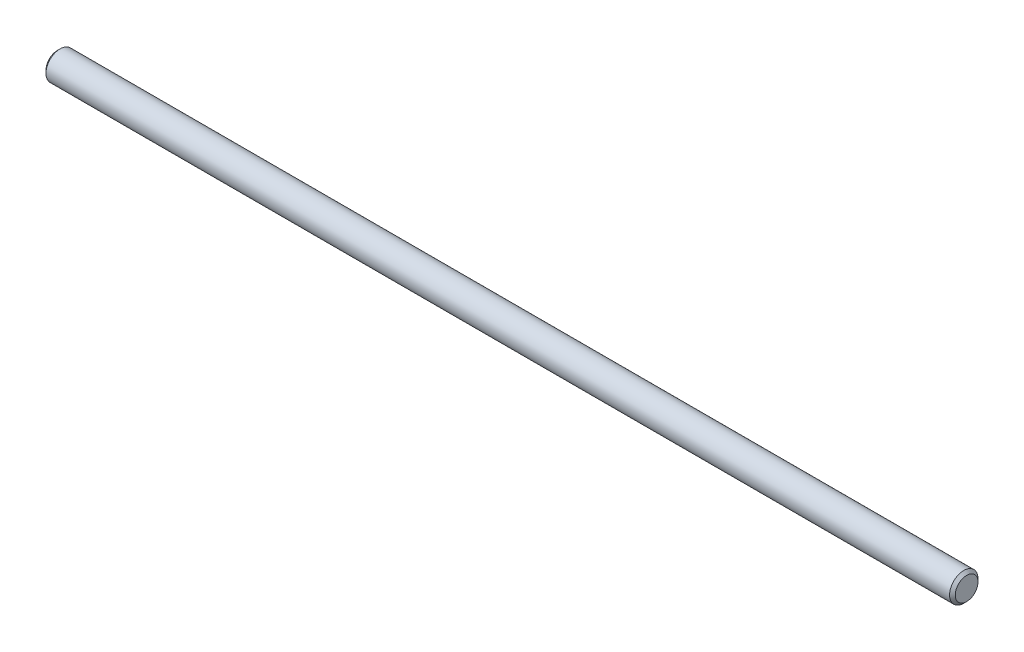
ISO-10303-21;
HEADER;
FILE_DESCRIPTION(('STEP AP214'),'2;1');
FILE_NAME('part.step','',(''),(''),'','','');
FILE_SCHEMA(('AUTOMOTIVE_DESIGN { 1 0 10303 214 1 1 1 1 }'));
ENDSEC;
DATA;
#1=APPLICATION_CONTEXT('core data for automotive mechanical design processes');
#2=APPLICATION_PROTOCOL_DEFINITION('international standard','automotive_design',2000,#1);
#3=PRODUCT_CONTEXT('',#1,'mechanical');
#4=PRODUCT('Part','Part','',(#3));
#5=PRODUCT_RELATED_PRODUCT_CATEGORY('part','',(#4));
#6=PRODUCT_DEFINITION_FORMATION('','',#4);
#7=PRODUCT_DEFINITION_CONTEXT('part definition',#1,'design');
#8=PRODUCT_DEFINITION('design','',#6,#7);
#9=PRODUCT_DEFINITION_SHAPE('','',#8);
#10=(LENGTH_UNIT() NAMED_UNIT(*) SI_UNIT(.MILLI.,.METRE.));
#11=(NAMED_UNIT(*) PLANE_ANGLE_UNIT() SI_UNIT($,.RADIAN.));
#12=(NAMED_UNIT(*) SI_UNIT($,.STERADIAN.) SOLID_ANGLE_UNIT());
#13=UNCERTAINTY_MEASURE_WITH_UNIT(LENGTH_MEASURE(1.E-05),#10,'distance_accuracy_value','');
#14=(GEOMETRIC_REPRESENTATION_CONTEXT(3) GLOBAL_UNCERTAINTY_ASSIGNED_CONTEXT((#13)) GLOBAL_UNIT_ASSIGNED_CONTEXT((#10,
#11,#12)) REPRESENTATION_CONTEXT('',''));
#15=CARTESIAN_POINT('',(0.,0.,0.));
#16=DIRECTION('',(0.,0.,1.));
#17=DIRECTION('',(1.,0.,0.));
#18=AXIS2_PLACEMENT_3D('',#15,#16,#17);
#19=CARTESIAN_POINT('',(-101.6,0.,0.));
#20=DIRECTION('',(1.,0.,0.));
#21=DIRECTION('',(0.,0.,-1.));
#22=AXIS2_PLACEMENT_3D('',#19,#20,#21);
#23=CYLINDRICAL_SURFACE('',#22,3.175);
#24=CARTESIAN_POINT('',(100.965,0.,0.));
#25=DIRECTION('',(1.,0.,0.));
#26=DIRECTION('',(0.,0.,-1.));
#27=AXIS2_PLACEMENT_3D('',#24,#25,#26);
#28=CIRCLE('',#27,3.175);
#29=CARTESIAN_POINT('',(100.965,0.,-3.175));
#30=VERTEX_POINT('',#29);
#31=EDGE_CURVE('E47',#30,#30,#28,.F.);
#32=ORIENTED_EDGE('',*,*,#31,.T.);
#33=EDGE_LOOP('',(#32));
#34=FACE_BOUND('',#33,.T.);
#35=CARTESIAN_POINT('',(-100.965,0.,0.));
#36=DIRECTION('',(1.,0.,0.));
#37=DIRECTION('',(0.,0.,-1.));
#38=AXIS2_PLACEMENT_3D('',#35,#36,#37);
#39=CIRCLE('',#38,3.175);
#40=CARTESIAN_POINT('',(-100.965,0.,-3.175));
#41=VERTEX_POINT('',#40);
#42=EDGE_CURVE('E52',#41,#41,#39,.T.);
#43=ORIENTED_EDGE('',*,*,#42,.T.);
#44=EDGE_LOOP('',(#43));
#45=FACE_BOUND('',#44,.T.);
#46=ADVANCED_FACE('F39',(#34,#45),#23,.T.);
#47=CARTESIAN_POINT('',(-101.6,0.,0.));
#48=DIRECTION('',(1.,0.,0.));
#49=DIRECTION('',(0.,0.,-1.));
#50=AXIS2_PLACEMENT_3D('',#47,#48,#49);
#51=PLANE('',#50);
#52=CARTESIAN_POINT('',(-101.6,0.,0.));
#53=DIRECTION('',(1.,0.,0.));
#54=DIRECTION('',(0.,0.,-1.));
#55=AXIS2_PLACEMENT_3D('',#52,#53,#54);
#56=CIRCLE('',#55,2.53999999999999);
#57=CARTESIAN_POINT('',(-101.6,0.,-2.53999999999999));
#58=VERTEX_POINT('',#57);
#59=EDGE_CURVE('E10',#58,#58,#56,.F.);
#60=ORIENTED_EDGE('',*,*,#59,.T.);
#61=EDGE_LOOP('',(#60));
#62=FACE_BOUND('',#61,.T.);
#63=ADVANCED_FACE('F74',(#62),#51,.F.);
#64=CARTESIAN_POINT('',(101.6,0.,0.));
#65=DIRECTION('',(1.,0.,0.));
#66=DIRECTION('',(0.,0.,-1.));
#67=AXIS2_PLACEMENT_3D('',#64,#65,#66);
#68=PLANE('',#67);
#69=CARTESIAN_POINT('',(101.6,0.,0.));
#70=DIRECTION('',(1.,0.,0.));
#71=DIRECTION('',(0.,0.,-1.));
#72=AXIS2_PLACEMENT_3D('',#69,#70,#71);
#73=CIRCLE('',#72,2.54000000000001);
#74=CARTESIAN_POINT('',(101.6,0.,-2.54000000000001));
#75=VERTEX_POINT('',#74);
#76=EDGE_CURVE('E57',#75,#75,#73,.T.);
#77=ORIENTED_EDGE('',*,*,#76,.T.);
#78=EDGE_LOOP('',(#77));
#79=FACE_BOUND('',#78,.T.);
#80=ADVANCED_FACE('F64',(#79),#68,.T.);
#81=CARTESIAN_POINT('',(101.6,0.,0.));
#82=DIRECTION('',(-1.,0.,0.));
#83=DIRECTION('',(0.,0.,1.));
#84=AXIS2_PLACEMENT_3D('',#81,#82,#83);
#85=CONICAL_SURFACE('',#84,2.54000000000001,0.785398163397439);
#86=ORIENTED_EDGE('',*,*,#31,.F.);
#87=EDGE_LOOP('',(#86));
#88=FACE_BOUND('',#87,.T.);
#89=ORIENTED_EDGE('',*,*,#76,.F.);
#90=EDGE_LOOP('',(#89));
#91=FACE_BOUND('',#90,.T.);
#92=ADVANCED_FACE('F66',(#88,#91),#85,.T.);
#93=CARTESIAN_POINT('',(-100.965,0.,0.));
#94=DIRECTION('',(1.,0.,0.));
#95=DIRECTION('',(0.,0.,-1.));
#96=AXIS2_PLACEMENT_3D('',#93,#94,#95);
#97=CONICAL_SURFACE('',#96,3.175,0.785398163397461);
#98=ORIENTED_EDGE('',*,*,#59,.F.);
#99=EDGE_LOOP('',(#98));
#100=FACE_BOUND('',#99,.T.);
#101=ORIENTED_EDGE('',*,*,#42,.F.);
#102=EDGE_LOOP('',(#101));
#103=FACE_BOUND('',#102,.T.);
#104=ADVANCED_FACE('F41',(#100,#103),#97,.T.);
#105=CLOSED_SHELL('',(#46,#63,#80,#92,#104));
#106=MANIFOLD_SOLID_BREP('B2',#105);
#107=ADVANCED_BREP_SHAPE_REPRESENTATION('',(#18,#106),#14);
#108=SHAPE_DEFINITION_REPRESENTATION(#9,#107);
ENDSEC;
END-ISO-10303-21;
